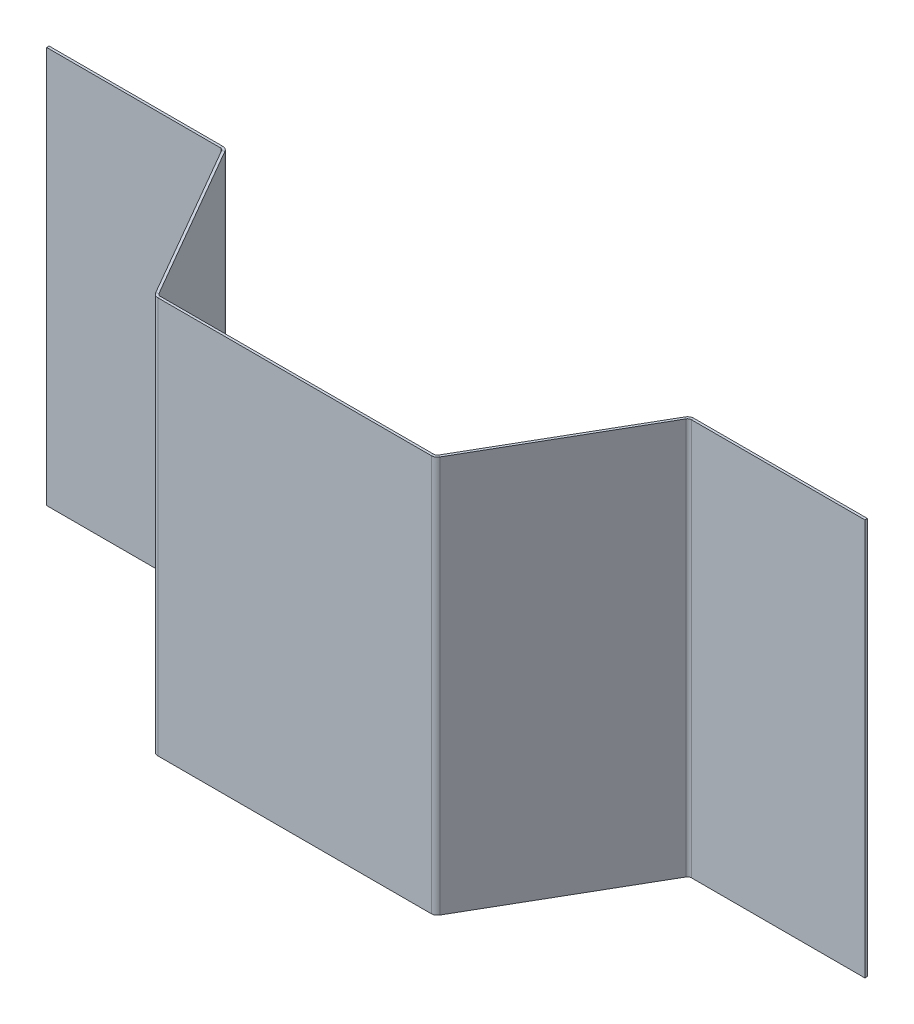
ISO-10303-21;
HEADER;
FILE_DESCRIPTION(('STEP AP214'),'2;1');
FILE_NAME('part.step','',(''),(''),'','','');
FILE_SCHEMA(('AUTOMOTIVE_DESIGN { 1 0 10303 214 1 1 1 1 }'));
ENDSEC;
DATA;
#1=APPLICATION_CONTEXT('core data for automotive mechanical design processes');
#2=APPLICATION_PROTOCOL_DEFINITION('international standard','automotive_design',2000,#1);
#3=PRODUCT_CONTEXT('',#1,'mechanical');
#4=PRODUCT('Part','Part','',(#3));
#5=PRODUCT_RELATED_PRODUCT_CATEGORY('part','',(#4));
#6=PRODUCT_DEFINITION_FORMATION('','',#4);
#7=PRODUCT_DEFINITION_CONTEXT('part definition',#1,'design');
#8=PRODUCT_DEFINITION('design','',#6,#7);
#9=PRODUCT_DEFINITION_SHAPE('','',#8);
#10=(LENGTH_UNIT() NAMED_UNIT(*) SI_UNIT(.MILLI.,.METRE.));
#11=(NAMED_UNIT(*) PLANE_ANGLE_UNIT() SI_UNIT($,.RADIAN.));
#12=(NAMED_UNIT(*) SI_UNIT($,.STERADIAN.) SOLID_ANGLE_UNIT());
#13=UNCERTAINTY_MEASURE_WITH_UNIT(LENGTH_MEASURE(1.E-05),#10,'distance_accuracy_value','');
#14=(GEOMETRIC_REPRESENTATION_CONTEXT(3) GLOBAL_UNCERTAINTY_ASSIGNED_CONTEXT((#13)) GLOBAL_UNIT_ASSIGNED_CONTEXT((#10,
#11,#12)) REPRESENTATION_CONTEXT('',''));
#15=CARTESIAN_POINT('',(0.,0.,0.));
#16=DIRECTION('',(0.,0.,1.));
#17=DIRECTION('',(1.,0.,0.));
#18=AXIS2_PLACEMENT_3D('',#15,#16,#17);
#19=CARTESIAN_POINT('',(92.8060796608384,-160.,-63.75));
#20=DIRECTION('',(0.,-1.,0.));
#21=DIRECTION('',(0.,0.,-1.));
#22=AXIS2_PLACEMENT_3D('',#19,#20,#21);
#23=PLANE('',#22);
#24=DIRECTION('',(0.866025403784445,0.,0.499999999999988));
#25=VECTOR('',#24,1.);
#26=CARTESIAN_POINT('',(92.8060796608384,-160.,-63.75));
#27=LINE('',#26,#25);
#28=CARTESIAN_POINT('',(92.8060796608384,-160.,-63.75));
#29=VERTEX_POINT('',#28);
#30=CARTESIAN_POINT('',(93.6721050646228,-160.,-63.25));
#31=VERTEX_POINT('',#30);
#32=EDGE_CURVE('E11',#29,#31,#27,.T.);
#33=ORIENTED_EDGE('',*,*,#32,.F.);
#34=CARTESIAN_POINT('',(94.9711431702995,-160.,-62.5));
#35=DIRECTION('',(0.,-1.,0.));
#36=DIRECTION('',(0.,0.,-1.));
#37=AXIS2_PLACEMENT_3D('',#34,#35,#36);
#38=CIRCLE('',#37,2.5);
#39=CARTESIAN_POINT('',(94.9711431702995,-160.,-65.));
#40=VERTEX_POINT('',#39);
#41=EDGE_CURVE('E367',#40,#29,#38,.F.);
#42=ORIENTED_EDGE('',*,*,#41,.F.);
#43=DIRECTION('',(0.,0.,-1.));
#44=VECTOR('',#43,1.);
#45=CARTESIAN_POINT('',(94.9711431702995,-160.,-64.));
#46=LINE('',#45,#44);
#47=CARTESIAN_POINT('',(94.9711431702995,-160.,-64.));
#48=VERTEX_POINT('',#47);
#49=EDGE_CURVE('E46',#48,#40,#46,.T.);
#50=ORIENTED_EDGE('',*,*,#49,.F.);
#51=CARTESIAN_POINT('',(94.9711431702995,-160.,-62.5));
#52=DIRECTION('',(0.,-1.,0.));
#53=DIRECTION('',(1.,0.,0.));
#54=AXIS2_PLACEMENT_3D('',#51,#52,#53);
#55=CIRCLE('',#54,1.5);
#56=EDGE_CURVE('E380',#48,#31,#55,.F.);
#57=ORIENTED_EDGE('',*,*,#56,.T.);
#58=EDGE_LOOP('',(#33,#42,#50,#57));
#59=FACE_BOUND('',#58,.T.);
#60=ADVANCED_FACE('F38',(#59),#23,.T.);
#61=CARTESIAN_POINT('',(94.9711431702995,-160.,-64.));
#62=DIRECTION('',(0.,-1.,0.));
#63=DIRECTION('',(0.,0.,-1.));
#64=AXIS2_PLACEMENT_3D('',#61,#62,#63);
#65=PLANE('',#64);
#66=DIRECTION('',(-0.499999999999998,0.,0.86602540378444));
#67=VECTOR('',#66,1.);
#68=CARTESIAN_POINT('',(56.,-160.,0.));
#69=LINE('',#68,#67);
#70=CARTESIAN_POINT('',(56.4330127018922,-160.,-0.75000000000002));
#71=VERTEX_POINT('',#70);
#72=EDGE_CURVE('E371',#29,#71,#69,.T.);
#73=ORIENTED_EDGE('',*,*,#72,.F.);
#74=ORIENTED_EDGE('',*,*,#32,.T.);
#75=DIRECTION('',(-0.499999999999998,0.,0.86602540378444));
#76=VECTOR('',#75,1.);
#77=CARTESIAN_POINT('',(56.8660254037844,-160.,0.499999999999985));
#78=LINE('',#77,#76);
#79=CARTESIAN_POINT('',(57.2990381056767,-160.,-0.250000000000021));
#80=VERTEX_POINT('',#79);
#81=EDGE_CURVE('E382',#31,#80,#78,.T.);
#82=ORIENTED_EDGE('',*,*,#81,.T.);
#83=DIRECTION('',(-0.86602540378444,0.,-0.499999999999997));
#84=VECTOR('',#83,1.);
#85=CARTESIAN_POINT('',(57.2990381056767,-160.,-0.250000000000021));
#86=LINE('',#85,#84);
#87=EDGE_CURVE('E341',#80,#71,#86,.T.);
#88=ORIENTED_EDGE('',*,*,#87,.T.);
#89=EDGE_LOOP('',(#73,#74,#82,#88));
#90=FACE_BOUND('',#89,.T.);
#91=ADVANCED_FACE('F451',(#90),#65,.T.);
#92=CARTESIAN_POINT('',(94.9711431702995,0.,-65.));
#93=DIRECTION('',(0.,1.,0.));
#94=DIRECTION('',(0.,0.,1.));
#95=AXIS2_PLACEMENT_3D('',#92,#93,#94);
#96=PLANE('',#95);
#97=DIRECTION('',(0.,0.,1.));
#98=VECTOR('',#97,1.);
#99=CARTESIAN_POINT('',(94.9711431702995,0.,-65.));
#100=LINE('',#99,#98);
#101=CARTESIAN_POINT('',(94.9711431702995,0.,-65.));
#102=VERTEX_POINT('',#101);
#103=CARTESIAN_POINT('',(94.9711431702995,0.,-64.));
#104=VERTEX_POINT('',#103);
#105=EDGE_CURVE('E347',#102,#104,#100,.T.);
#106=ORIENTED_EDGE('',*,*,#105,.F.);
#107=CARTESIAN_POINT('',(94.9711431702995,0.,-62.5));
#108=DIRECTION('',(0.,-1.,0.));
#109=DIRECTION('',(0.,0.,-1.));
#110=AXIS2_PLACEMENT_3D('',#107,#108,#109);
#111=CIRCLE('',#110,2.5);
#112=CARTESIAN_POINT('',(92.8060796608384,0.,-63.75));
#113=VERTEX_POINT('',#112);
#114=EDGE_CURVE('E251',#102,#113,#111,.F.);
#115=ORIENTED_EDGE('',*,*,#114,.T.);
#116=DIRECTION('',(-0.866025403784445,0.,-0.499999999999988));
#117=VECTOR('',#116,1.);
#118=CARTESIAN_POINT('',(93.6721050646228,0.,-63.25));
#119=LINE('',#118,#117);
#120=CARTESIAN_POINT('',(93.6721050646228,0.,-63.25));
#121=VERTEX_POINT('',#120);
#122=EDGE_CURVE('E345',#121,#113,#119,.T.);
#123=ORIENTED_EDGE('',*,*,#122,.F.);
#124=CARTESIAN_POINT('',(94.9711431702995,0.,-62.5));
#125=DIRECTION('',(0.,-1.,0.));
#126=DIRECTION('',(1.,0.,0.));
#127=AXIS2_PLACEMENT_3D('',#124,#125,#126);
#128=CIRCLE('',#127,1.5);
#129=EDGE_CURVE('E263',#104,#121,#128,.F.);
#130=ORIENTED_EDGE('',*,*,#129,.F.);
#131=EDGE_LOOP('',(#106,#115,#123,#130));
#132=FACE_BOUND('',#131,.T.);
#133=ADVANCED_FACE('F493',(#132),#96,.T.);
#134=CARTESIAN_POINT('',(93.6721050646228,0.,-63.25));
#135=DIRECTION('',(0.,1.,0.));
#136=DIRECTION('',(0.,0.,1.));
#137=AXIS2_PLACEMENT_3D('',#134,#135,#136);
#138=PLANE('',#137);
#139=DIRECTION('',(-1.,0.,0.));
#140=VECTOR('',#139,1.);
#141=CARTESIAN_POINT('',(93.5277674973254,0.,-65.));
#142=LINE('',#141,#140);
#143=CARTESIAN_POINT('',(165.,0.,-65.));
#144=VERTEX_POINT('',#143);
#145=EDGE_CURVE('E254',#144,#102,#142,.T.);
#146=ORIENTED_EDGE('',*,*,#145,.T.);
#147=ORIENTED_EDGE('',*,*,#105,.T.);
#148=DIRECTION('',(1.,0.,0.));
#149=VECTOR('',#148,1.);
#150=CARTESIAN_POINT('',(93.5277674973254,0.,-64.));
#151=LINE('',#150,#149);
#152=CARTESIAN_POINT('',(165.,0.,-64.));
#153=VERTEX_POINT('',#152);
#154=EDGE_CURVE('E260',#153,#104,#151,.F.);
#155=ORIENTED_EDGE('',*,*,#154,.F.);
#156=DIRECTION('',(0.,0.,-1.));
#157=VECTOR('',#156,1.);
#158=CARTESIAN_POINT('',(165.,0.,-64.));
#159=LINE('',#158,#157);
#160=EDGE_CURVE('E257',#153,#144,#159,.T.);
#161=ORIENTED_EDGE('',*,*,#160,.T.);
#162=EDGE_LOOP('',(#146,#147,#155,#161));
#163=FACE_BOUND('',#162,.T.);
#164=ADVANCED_FACE('F497',(#163),#138,.T.);
#165=CARTESIAN_POINT('',(55.1339745962156,-160.,0.));
#166=DIRECTION('',(0.,-1.,0.));
#167=DIRECTION('',(0.,0.,-1.));
#168=AXIS2_PLACEMENT_3D('',#165,#166,#167);
#169=PLANE('',#168);
#170=DIRECTION('',(0.,0.,1.));
#171=VECTOR('',#170,1.);
#172=CARTESIAN_POINT('',(55.1339745962156,-160.,0.));
#173=LINE('',#172,#171);
#174=CARTESIAN_POINT('',(55.1339745962156,-160.,0.));
#175=VERTEX_POINT('',#174);
#176=CARTESIAN_POINT('',(55.1339745962156,-160.,0.999999999999987));
#177=VERTEX_POINT('',#176);
#178=EDGE_CURVE('E343',#175,#177,#173,.T.);
#179=ORIENTED_EDGE('',*,*,#178,.F.);
#180=CARTESIAN_POINT('',(55.1339745962156,-160.,-1.50000000000001));
#181=DIRECTION('',(0.,1.,0.));
#182=DIRECTION('',(0.,0.,1.));
#183=AXIS2_PLACEMENT_3D('',#180,#181,#182);
#184=CIRCLE('',#183,1.5);
#185=EDGE_CURVE('E441',#71,#175,#184,.F.);
#186=ORIENTED_EDGE('',*,*,#185,.F.);
#187=ORIENTED_EDGE('',*,*,#87,.F.);
#188=CARTESIAN_POINT('',(55.1339745962156,-160.,-1.50000000000001));
#189=DIRECTION('',(0.,-1.,0.));
#190=DIRECTION('',(1.,0.,0.));
#191=AXIS2_PLACEMENT_3D('',#188,#189,#190);
#192=CIRCLE('',#191,2.5);
#193=EDGE_CURVE('E385',#80,#177,#192,.T.);
#194=ORIENTED_EDGE('',*,*,#193,.T.);
#195=EDGE_LOOP('',(#179,#186,#187,#194));
#196=FACE_BOUND('',#195,.T.);
#197=ADVANCED_FACE('F458',(#196),#169,.T.);
#198=CARTESIAN_POINT('',(57.2990381056767,-160.,-0.250000000000021));
#199=DIRECTION('',(0.,-1.,0.));
#200=DIRECTION('',(0.,0.,-1.));
#201=AXIS2_PLACEMENT_3D('',#198,#199,#200);
#202=PLANE('',#201);
#203=DIRECTION('',(-1.,0.,0.));
#204=VECTOR('',#203,1.);
#205=CARTESIAN_POINT('',(56.,-160.,0.));
#206=LINE('',#205,#204);
#207=CARTESIAN_POINT('',(-55.1339745962156,-160.,0.));
#208=VERTEX_POINT('',#207);
#209=EDGE_CURVE('E438',#175,#208,#206,.T.);
#210=ORIENTED_EDGE('',*,*,#209,.F.);
#211=ORIENTED_EDGE('',*,*,#178,.T.);
#212=DIRECTION('',(1.,0.,0.));
#213=VECTOR('',#212,1.);
#214=CARTESIAN_POINT('',(56.,-160.,0.999999999999987));
#215=LINE('',#214,#213);
#216=CARTESIAN_POINT('',(-55.1339745962156,-160.,0.999999999999988));
#217=VERTEX_POINT('',#216);
#218=EDGE_CURVE('E205',#177,#217,#215,.F.);
#219=ORIENTED_EDGE('',*,*,#218,.T.);
#220=DIRECTION('',(0.,0.,-1.));
#221=VECTOR('',#220,1.);
#222=CARTESIAN_POINT('',(-55.1339745962156,-160.,0.999999999999988));
#223=LINE('',#222,#221);
#224=EDGE_CURVE('E196',#217,#208,#223,.T.);
#225=ORIENTED_EDGE('',*,*,#224,.T.);
#226=EDGE_LOOP('',(#210,#211,#219,#225));
#227=FACE_BOUND('',#226,.T.);
#228=ADVANCED_FACE('F391',(#227),#202,.T.);
#229=CARTESIAN_POINT('',(56.4330127018922,0.,-0.75000000000002));
#230=DIRECTION('',(0.,1.,0.));
#231=DIRECTION('',(0.,0.,1.));
#232=AXIS2_PLACEMENT_3D('',#229,#230,#231);
#233=PLANE('',#232);
#234=DIRECTION('',(0.86602540378444,0.,0.499999999999997));
#235=VECTOR('',#234,1.);
#236=CARTESIAN_POINT('',(56.4330127018922,0.,-0.75000000000002));
#237=LINE('',#236,#235);
#238=CARTESIAN_POINT('',(56.4330127018922,0.,-0.75000000000002));
#239=VERTEX_POINT('',#238);
#240=CARTESIAN_POINT('',(57.2990381056767,0.,-0.250000000000021));
#241=VERTEX_POINT('',#240);
#242=EDGE_CURVE('E339',#239,#241,#237,.T.);
#243=ORIENTED_EDGE('',*,*,#242,.F.);
#244=CARTESIAN_POINT('',(55.1339745962156,0.,-1.50000000000001));
#245=DIRECTION('',(0.,1.,0.));
#246=DIRECTION('',(0.,0.,1.));
#247=AXIS2_PLACEMENT_3D('',#244,#245,#246);
#248=CIRCLE('',#247,1.5);
#249=CARTESIAN_POINT('',(55.1339745962156,0.,0.));
#250=VERTEX_POINT('',#249);
#251=EDGE_CURVE('E245',#239,#250,#248,.F.);
#252=ORIENTED_EDGE('',*,*,#251,.T.);
#253=DIRECTION('',(0.,0.,-1.));
#254=VECTOR('',#253,1.);
#255=CARTESIAN_POINT('',(55.1339745962156,0.,0.999999999999987));
#256=LINE('',#255,#254);
#257=CARTESIAN_POINT('',(55.1339745962156,0.,0.999999999999987));
#258=VERTEX_POINT('',#257);
#259=EDGE_CURVE('E195',#258,#250,#256,.T.);
#260=ORIENTED_EDGE('',*,*,#259,.F.);
#261=CARTESIAN_POINT('',(55.1339745962156,0.,-1.50000000000001));
#262=DIRECTION('',(0.,-1.,0.));
#263=DIRECTION('',(1.,0.,0.));
#264=AXIS2_PLACEMENT_3D('',#261,#262,#263);
#265=CIRCLE('',#264,2.5);
#266=EDGE_CURVE('E269',#241,#258,#265,.T.);
#267=ORIENTED_EDGE('',*,*,#266,.F.);
#268=EDGE_LOOP('',(#243,#252,#260,#267));
#269=FACE_BOUND('',#268,.T.);
#270=ADVANCED_FACE('F467',(#269),#233,.T.);
#271=CARTESIAN_POINT('',(55.1339745962156,0.,0.999999999999987));
#272=DIRECTION('',(0.,1.,0.));
#273=DIRECTION('',(0.,0.,1.));
#274=AXIS2_PLACEMENT_3D('',#271,#272,#273);
#275=PLANE('',#274);
#276=DIRECTION('',(-0.499999999999998,0.,0.86602540378444));
#277=VECTOR('',#276,1.);
#278=CARTESIAN_POINT('',(56.,0.,0.));
#279=LINE('',#278,#277);
#280=EDGE_CURVE('E248',#113,#239,#279,.T.);
#281=ORIENTED_EDGE('',*,*,#280,.T.);
#282=ORIENTED_EDGE('',*,*,#242,.T.);
#283=DIRECTION('',(-0.499999999999998,0.,0.86602540378444));
#284=VECTOR('',#283,1.);
#285=CARTESIAN_POINT('',(56.8660254037844,0.,0.499999999999985));
#286=LINE('',#285,#284);
#287=EDGE_CURVE('E266',#121,#241,#286,.T.);
#288=ORIENTED_EDGE('',*,*,#287,.F.);
#289=ORIENTED_EDGE('',*,*,#122,.T.);
#290=EDGE_LOOP('',(#281,#282,#288,#289));
#291=FACE_BOUND('',#290,.T.);
#292=ADVANCED_FACE('F471',(#291),#275,.T.);
#293=CARTESIAN_POINT('',(-56.4330127018922,-160.,-0.750000000000017));
#294=DIRECTION('',(0.,-1.,0.));
#295=DIRECTION('',(0.,0.,-1.));
#296=AXIS2_PLACEMENT_3D('',#293,#294,#295);
#297=PLANE('',#296);
#298=DIRECTION('',(-0.866025403784441,0.,0.499999999999995));
#299=VECTOR('',#298,1.);
#300=CARTESIAN_POINT('',(-56.4330127018922,-160.,-0.750000000000017));
#301=LINE('',#300,#299);
#302=CARTESIAN_POINT('',(-56.4330127018922,-160.,-0.750000000000017));
#303=VERTEX_POINT('',#302);
#304=CARTESIAN_POINT('',(-57.2990381056767,-160.,-0.250000000000021));
#305=VERTEX_POINT('',#304);
#306=EDGE_CURVE('E183',#303,#305,#301,.T.);
#307=ORIENTED_EDGE('',*,*,#306,.F.);
#308=CARTESIAN_POINT('',(-55.1339745962156,-160.,-1.50000000000001));
#309=DIRECTION('',(0.,1.,0.));
#310=DIRECTION('',(0.,0.,1.));
#311=AXIS2_PLACEMENT_3D('',#308,#309,#310);
#312=CIRCLE('',#311,1.5);
#313=EDGE_CURVE('E403',#208,#303,#312,.F.);
#314=ORIENTED_EDGE('',*,*,#313,.F.);
#315=ORIENTED_EDGE('',*,*,#224,.F.);
#316=CARTESIAN_POINT('',(-55.1339745962156,-160.,-1.50000000000001));
#317=DIRECTION('',(0.,-1.,0.));
#318=DIRECTION('',(1.,0.,0.));
#319=AXIS2_PLACEMENT_3D('',#316,#317,#318);
#320=CIRCLE('',#319,2.5);
#321=EDGE_CURVE('E199',#217,#305,#320,.T.);
#322=ORIENTED_EDGE('',*,*,#321,.T.);
#323=EDGE_LOOP('',(#307,#314,#315,#322));
#324=FACE_BOUND('',#323,.T.);
#325=ADVANCED_FACE('F201',(#324),#297,.T.);
#326=CARTESIAN_POINT('',(-55.1339745962156,-160.,0.999999999999988));
#327=DIRECTION('',(0.,-1.,0.));
#328=DIRECTION('',(0.,0.,-1.));
#329=AXIS2_PLACEMENT_3D('',#326,#327,#328);
#330=PLANE('',#329);
#331=DIRECTION('',(-0.499999999999998,0.,-0.86602540378444));
#332=VECTOR('',#331,1.);
#333=CARTESIAN_POINT('',(-56.,-160.,0.));
#334=LINE('',#333,#332);
#335=CARTESIAN_POINT('',(-92.8060796608384,-160.,-63.75));
#336=VERTEX_POINT('',#335);
#337=EDGE_CURVE('E190',#303,#336,#334,.T.);
#338=ORIENTED_EDGE('',*,*,#337,.F.);
#339=ORIENTED_EDGE('',*,*,#306,.T.);
#340=DIRECTION('',(-0.499999999999998,0.,-0.86602540378444));
#341=VECTOR('',#340,1.);
#342=CARTESIAN_POINT('',(-56.8660254037844,-160.,0.499999999999985));
#343=LINE('',#342,#341);
#344=CARTESIAN_POINT('',(-93.6721050646228,-160.,-63.25));
#345=VERTEX_POINT('',#344);
#346=EDGE_CURVE('E187',#305,#345,#343,.T.);
#347=ORIENTED_EDGE('',*,*,#346,.T.);
#348=DIRECTION('',(0.866025403784439,0.,-0.499999999999998));
#349=VECTOR('',#348,1.);
#350=CARTESIAN_POINT('',(-93.6721050646228,-160.,-63.25));
#351=LINE('',#350,#349);
#352=EDGE_CURVE('E330',#345,#336,#351,.T.);
#353=ORIENTED_EDGE('',*,*,#352,.T.);
#354=EDGE_LOOP('',(#338,#339,#347,#353));
#355=FACE_BOUND('',#354,.T.);
#356=ADVANCED_FACE('F185',(#355),#330,.T.);
#357=CARTESIAN_POINT('',(-55.1339745962156,0.,0.));
#358=DIRECTION('',(0.,1.,0.));
#359=DIRECTION('',(0.,0.,1.));
#360=AXIS2_PLACEMENT_3D('',#357,#358,#359);
#361=PLANE('',#360);
#362=DIRECTION('',(0.,0.,1.));
#363=VECTOR('',#362,1.);
#364=CARTESIAN_POINT('',(-55.1339745962156,0.,0.));
#365=LINE('',#364,#363);
#366=CARTESIAN_POINT('',(-55.1339745962156,0.,0.));
#367=VERTEX_POINT('',#366);
#368=CARTESIAN_POINT('',(-55.1339745962156,0.,0.999999999999988));
#369=VERTEX_POINT('',#368);
#370=EDGE_CURVE('E335',#367,#369,#365,.T.);
#371=ORIENTED_EDGE('',*,*,#370,.F.);
#372=CARTESIAN_POINT('',(-55.1339745962156,0.,-1.50000000000001));
#373=DIRECTION('',(0.,1.,0.));
#374=DIRECTION('',(0.,0.,1.));
#375=AXIS2_PLACEMENT_3D('',#372,#373,#374);
#376=CIRCLE('',#375,1.5);
#377=CARTESIAN_POINT('',(-56.4330127018922,0.,-0.750000000000017));
#378=VERTEX_POINT('',#377);
#379=EDGE_CURVE('E239',#367,#378,#376,.F.);
#380=ORIENTED_EDGE('',*,*,#379,.T.);
#381=DIRECTION('',(0.866025403784441,0.,-0.499999999999995));
#382=VECTOR('',#381,1.);
#383=CARTESIAN_POINT('',(-57.2990381056767,0.,-0.250000000000021));
#384=LINE('',#383,#382);
#385=CARTESIAN_POINT('',(-57.2990381056767,0.,-0.250000000000021));
#386=VERTEX_POINT('',#385);
#387=EDGE_CURVE('E333',#386,#378,#384,.T.);
#388=ORIENTED_EDGE('',*,*,#387,.F.);
#389=CARTESIAN_POINT('',(-55.1339745962156,0.,-1.50000000000001));
#390=DIRECTION('',(0.,-1.,0.));
#391=DIRECTION('',(1.,0.,0.));
#392=AXIS2_PLACEMENT_3D('',#389,#390,#391);
#393=CIRCLE('',#392,2.5);
#394=EDGE_CURVE('E212',#369,#386,#393,.T.);
#395=ORIENTED_EDGE('',*,*,#394,.F.);
#396=EDGE_LOOP('',(#371,#380,#388,#395));
#397=FACE_BOUND('',#396,.T.);
#398=ADVANCED_FACE('F397',(#397),#361,.T.);
#399=CARTESIAN_POINT('',(-57.2990381056767,0.,-0.250000000000021));
#400=DIRECTION('',(0.,1.,0.));
#401=DIRECTION('',(0.,0.,1.));
#402=AXIS2_PLACEMENT_3D('',#399,#400,#401);
#403=PLANE('',#402);
#404=DIRECTION('',(-1.,0.,0.));
#405=VECTOR('',#404,1.);
#406=CARTESIAN_POINT('',(56.,0.,0.));
#407=LINE('',#406,#405);
#408=EDGE_CURVE('E242',#250,#367,#407,.T.);
#409=ORIENTED_EDGE('',*,*,#408,.T.);
#410=ORIENTED_EDGE('',*,*,#370,.T.);
#411=DIRECTION('',(1.,0.,0.));
#412=VECTOR('',#411,1.);
#413=CARTESIAN_POINT('',(56.,0.,0.999999999999987));
#414=LINE('',#413,#412);
#415=EDGE_CURVE('E272',#258,#369,#414,.F.);
#416=ORIENTED_EDGE('',*,*,#415,.F.);
#417=ORIENTED_EDGE('',*,*,#259,.T.);
#418=EDGE_LOOP('',(#409,#410,#416,#417));
#419=FACE_BOUND('',#418,.T.);
#420=ADVANCED_FACE('F477',(#419),#403,.T.);
#421=CARTESIAN_POINT('',(-94.9711431702995,-160.,-65.));
#422=DIRECTION('',(0.,-1.,0.));
#423=DIRECTION('',(0.,0.,-1.));
#424=AXIS2_PLACEMENT_3D('',#421,#422,#423);
#425=PLANE('',#424);
#426=DIRECTION('',(0.,0.,1.));
#427=VECTOR('',#426,1.);
#428=CARTESIAN_POINT('',(-94.9711431702995,-160.,-65.));
#429=LINE('',#428,#427);
#430=CARTESIAN_POINT('',(-94.9711431702995,-160.,-65.));
#431=VERTEX_POINT('',#430);
#432=CARTESIAN_POINT('',(-94.9711431702995,-160.,-64.));
#433=VERTEX_POINT('',#432);
#434=EDGE_CURVE('E54',#431,#433,#429,.T.);
#435=ORIENTED_EDGE('',*,*,#434,.F.);
#436=CARTESIAN_POINT('',(-94.9711431702995,-160.,-62.5));
#437=DIRECTION('',(0.,-1.,0.));
#438=DIRECTION('',(0.,0.,-1.));
#439=AXIS2_PLACEMENT_3D('',#436,#437,#438);
#440=CIRCLE('',#439,2.5);
#441=EDGE_CURVE('E431',#336,#431,#440,.F.);
#442=ORIENTED_EDGE('',*,*,#441,.F.);
#443=ORIENTED_EDGE('',*,*,#352,.F.);
#444=CARTESIAN_POINT('',(-94.9711431702995,-160.,-62.5));
#445=DIRECTION('',(0.,-1.,0.));
#446=DIRECTION('',(1.,0.,0.));
#447=AXIS2_PLACEMENT_3D('',#444,#445,#446);
#448=CIRCLE('',#447,1.5);
#449=EDGE_CURVE('E220',#345,#433,#448,.F.);
#450=ORIENTED_EDGE('',*,*,#449,.T.);
#451=EDGE_LOOP('',(#435,#442,#443,#450));
#452=FACE_BOUND('',#451,.T.);
#453=ADVANCED_FACE('F479',(#452),#425,.T.);
#454=CARTESIAN_POINT('',(-93.6721050646228,-160.,-63.25));
#455=DIRECTION('',(0.,-1.,0.));
#456=DIRECTION('',(0.,0.,-1.));
#457=AXIS2_PLACEMENT_3D('',#454,#455,#456);
#458=PLANE('',#457);
#459=DIRECTION('',(-1.,0.,0.));
#460=VECTOR('',#459,1.);
#461=CARTESIAN_POINT('',(-93.5277674973254,-160.,-65.));
#462=LINE('',#461,#460);
#463=CARTESIAN_POINT('',(-165.,-160.,-65.));
#464=VERTEX_POINT('',#463);
#465=EDGE_CURVE('E429',#431,#464,#462,.T.);
#466=ORIENTED_EDGE('',*,*,#465,.F.);
#467=ORIENTED_EDGE('',*,*,#434,.T.);
#468=DIRECTION('',(1.,0.,0.));
#469=VECTOR('',#468,1.);
#470=CARTESIAN_POINT('',(-93.5277674973254,-160.,-64.));
#471=LINE('',#470,#469);
#472=CARTESIAN_POINT('',(-165.,-160.,-64.));
#473=VERTEX_POINT('',#472);
#474=EDGE_CURVE('E132',#433,#473,#471,.F.);
#475=ORIENTED_EDGE('',*,*,#474,.T.);
#476=DIRECTION('',(0.,0.,1.));
#477=VECTOR('',#476,1.);
#478=CARTESIAN_POINT('',(-165.,-160.,-65.));
#479=LINE('',#478,#477);
#480=EDGE_CURVE('E427',#464,#473,#479,.T.);
#481=ORIENTED_EDGE('',*,*,#480,.F.);
#482=EDGE_LOOP('',(#466,#467,#475,#481));
#483=FACE_BOUND('',#482,.T.);
#484=ADVANCED_FACE('F485',(#483),#458,.T.);
#485=CARTESIAN_POINT('',(-92.8060796608384,0.,-63.75));
#486=DIRECTION('',(0.,1.,0.));
#487=DIRECTION('',(0.,0.,1.));
#488=AXIS2_PLACEMENT_3D('',#485,#486,#487);
#489=PLANE('',#488);
#490=DIRECTION('',(-0.866025403784439,0.,0.499999999999998));
#491=VECTOR('',#490,1.);
#492=CARTESIAN_POINT('',(-92.8060796608384,0.,-63.75));
#493=LINE('',#492,#491);
#494=CARTESIAN_POINT('',(-92.8060796608384,0.,-63.75));
#495=VERTEX_POINT('',#494);
#496=CARTESIAN_POINT('',(-93.6721050646228,0.,-63.25));
#497=VERTEX_POINT('',#496);
#498=EDGE_CURVE('E119',#495,#497,#493,.T.);
#499=ORIENTED_EDGE('',*,*,#498,.F.);
#500=CARTESIAN_POINT('',(-94.9711431702995,0.,-62.5));
#501=DIRECTION('',(0.,-1.,0.));
#502=DIRECTION('',(0.,0.,-1.));
#503=AXIS2_PLACEMENT_3D('',#500,#501,#502);
#504=CIRCLE('',#503,2.5);
#505=CARTESIAN_POINT('',(-94.9711431702995,0.,-65.));
#506=VERTEX_POINT('',#505);
#507=EDGE_CURVE('E235',#495,#506,#504,.F.);
#508=ORIENTED_EDGE('',*,*,#507,.T.);
#509=DIRECTION('',(0.,0.,-1.));
#510=VECTOR('',#509,1.);
#511=CARTESIAN_POINT('',(-94.9711431702995,0.,-64.));
#512=LINE('',#511,#510);
#513=CARTESIAN_POINT('',(-94.9711431702995,0.,-64.));
#514=VERTEX_POINT('',#513);
#515=EDGE_CURVE('E126',#514,#506,#512,.T.);
#516=ORIENTED_EDGE('',*,*,#515,.F.);
#517=CARTESIAN_POINT('',(-94.9711431702995,0.,-62.5));
#518=DIRECTION('',(0.,-1.,0.));
#519=DIRECTION('',(1.,0.,0.));
#520=AXIS2_PLACEMENT_3D('',#517,#518,#519);
#521=CIRCLE('',#520,1.5);
#522=EDGE_CURVE('E278',#497,#514,#521,.F.);
#523=ORIENTED_EDGE('',*,*,#522,.F.);
#524=EDGE_LOOP('',(#499,#508,#516,#523));
#525=FACE_BOUND('',#524,.T.);
#526=ADVANCED_FACE('F414',(#525),#489,.T.);
#527=CARTESIAN_POINT('',(-94.9711431702995,0.,-64.));
#528=DIRECTION('',(0.,1.,0.));
#529=DIRECTION('',(0.,0.,1.));
#530=AXIS2_PLACEMENT_3D('',#527,#528,#529);
#531=PLANE('',#530);
#532=DIRECTION('',(-0.499999999999998,0.,-0.86602540378444));
#533=VECTOR('',#532,1.);
#534=CARTESIAN_POINT('',(-56.,0.,0.));
#535=LINE('',#534,#533);
#536=EDGE_CURVE('E237',#378,#495,#535,.T.);
#537=ORIENTED_EDGE('',*,*,#536,.T.);
#538=ORIENTED_EDGE('',*,*,#498,.T.);
#539=DIRECTION('',(-0.499999999999998,0.,-0.86602540378444));
#540=VECTOR('',#539,1.);
#541=CARTESIAN_POINT('',(-56.8660254037844,0.,0.499999999999985));
#542=LINE('',#541,#540);
#543=EDGE_CURVE('E276',#386,#497,#542,.T.);
#544=ORIENTED_EDGE('',*,*,#543,.F.);
#545=ORIENTED_EDGE('',*,*,#387,.T.);
#546=EDGE_LOOP('',(#537,#538,#544,#545));
#547=FACE_BOUND('',#546,.T.);
#548=ADVANCED_FACE('F399',(#547),#531,.T.);
#549=CARTESIAN_POINT('',(-93.5277674973254,-160.,-64.));
#550=DIRECTION('',(0.,0.,-1.));
#551=DIRECTION('',(-1.,0.,0.));
#552=AXIS2_PLACEMENT_3D('',#549,#550,#551);
#553=PLANE('',#552);
#554=DIRECTION('',(1.,0.,0.));
#555=VECTOR('',#554,1.);
#556=CARTESIAN_POINT('',(-93.5277674973254,0.,-64.));
#557=LINE('',#556,#555);
#558=CARTESIAN_POINT('',(-165.,0.,-64.));
#559=VERTEX_POINT('',#558);
#560=EDGE_CURVE('E226',#514,#559,#557,.F.);
#561=ORIENTED_EDGE('',*,*,#560,.T.);
#562=DIRECTION('',(0.,1.,0.));
#563=VECTOR('',#562,1.);
#564=CARTESIAN_POINT('',(-165.,-160.,-64.));
#565=LINE('',#564,#563);
#566=EDGE_CURVE('E326',#473,#559,#565,.T.);
#567=ORIENTED_EDGE('',*,*,#566,.F.);
#568=ORIENTED_EDGE('',*,*,#474,.F.);
#569=DIRECTION('',(0.,1.,0.));
#570=VECTOR('',#569,1.);
#571=CARTESIAN_POINT('',(-94.9711431702995,-160.,-64.));
#572=LINE('',#571,#570);
#573=EDGE_CURVE('E222',#433,#514,#572,.T.);
#574=ORIENTED_EDGE('',*,*,#573,.T.);
#575=EDGE_LOOP('',(#561,#567,#568,#574));
#576=FACE_BOUND('',#575,.T.);
#577=ADVANCED_FACE('F420',(#576),#553,.F.);
#578=CARTESIAN_POINT('',(-165.,-160.,-65.));
#579=DIRECTION('',(-1.,0.,0.));
#580=DIRECTION('',(0.,0.,1.));
#581=AXIS2_PLACEMENT_3D('',#578,#579,#580);
#582=PLANE('',#581);
#583=DIRECTION('',(0.,0.,1.));
#584=VECTOR('',#583,1.);
#585=CARTESIAN_POINT('',(-165.,0.,-65.));
#586=LINE('',#585,#584);
#587=CARTESIAN_POINT('',(-165.,0.,-65.));
#588=VERTEX_POINT('',#587);
#589=EDGE_CURVE('E229',#588,#559,#586,.T.);
#590=ORIENTED_EDGE('',*,*,#589,.F.);
#591=DIRECTION('',(0.,1.,0.));
#592=VECTOR('',#591,1.);
#593=CARTESIAN_POINT('',(-165.,-160.,-65.));
#594=LINE('',#593,#592);
#595=EDGE_CURVE('E324',#464,#588,#594,.T.);
#596=ORIENTED_EDGE('',*,*,#595,.F.);
#597=ORIENTED_EDGE('',*,*,#480,.T.);
#598=ORIENTED_EDGE('',*,*,#566,.T.);
#599=EDGE_LOOP('',(#590,#596,#597,#598));
#600=FACE_BOUND('',#599,.T.);
#601=ADVANCED_FACE('F425',(#600),#582,.T.);
#602=CARTESIAN_POINT('',(-93.5277674973254,-160.,-65.));
#603=DIRECTION('',(0.,0.,-1.));
#604=DIRECTION('',(-1.,0.,0.));
#605=AXIS2_PLACEMENT_3D('',#602,#603,#604);
#606=PLANE('',#605);
#607=DIRECTION('',(-1.,0.,0.));
#608=VECTOR('',#607,1.);
#609=CARTESIAN_POINT('',(-93.5277674973254,0.,-65.));
#610=LINE('',#609,#608);
#611=EDGE_CURVE('E232',#506,#588,#610,.T.);
#612=ORIENTED_EDGE('',*,*,#611,.F.);
#613=DIRECTION('',(0.,1.,0.));
#614=VECTOR('',#613,1.);
#615=CARTESIAN_POINT('',(-94.9711431702995,-160.,-65.));
#616=LINE('',#615,#614);
#617=EDGE_CURVE('E321',#431,#506,#616,.T.);
#618=ORIENTED_EDGE('',*,*,#617,.F.);
#619=ORIENTED_EDGE('',*,*,#465,.T.);
#620=ORIENTED_EDGE('',*,*,#595,.T.);
#621=EDGE_LOOP('',(#612,#618,#619,#620));
#622=FACE_BOUND('',#621,.T.);
#623=ADVANCED_FACE('F581',(#622),#606,.T.);
#624=CARTESIAN_POINT('',(-94.9711431702995,-160.,-62.5));
#625=DIRECTION('',(0.,1.,0.));
#626=DIRECTION('',(0.,0.,1.));
#627=AXIS2_PLACEMENT_3D('',#624,#625,#626);
#628=CYLINDRICAL_SURFACE('',#627,2.5);
#629=ORIENTED_EDGE('',*,*,#507,.F.);
#630=DIRECTION('',(0.,1.,0.));
#631=VECTOR('',#630,1.);
#632=CARTESIAN_POINT('',(-92.8060796608384,-160.,-63.75));
#633=LINE('',#632,#631);
#634=EDGE_CURVE('E318',#336,#495,#633,.T.);
#635=ORIENTED_EDGE('',*,*,#634,.F.);
#636=ORIENTED_EDGE('',*,*,#441,.T.);
#637=ORIENTED_EDGE('',*,*,#617,.T.);
#638=EDGE_LOOP('',(#629,#635,#636,#637));
#639=FACE_BOUND('',#638,.T.);
#640=ADVANCED_FACE('F411',(#639),#628,.T.);
#641=CARTESIAN_POINT('',(-56.,-160.,0.));
#642=DIRECTION('',(0.86602540378444,0.,-0.499999999999998));
#643=DIRECTION('',(-0.499999999999998,0.,-0.86602540378444));
#644=AXIS2_PLACEMENT_3D('',#641,#642,#643);
#645=PLANE('',#644);
#646=ORIENTED_EDGE('',*,*,#536,.F.);
#647=DIRECTION('',(0.,1.,0.));
#648=VECTOR('',#647,1.);
#649=CARTESIAN_POINT('',(-56.4330127018922,-160.,-0.750000000000017));
#650=LINE('',#649,#648);
#651=EDGE_CURVE('E315',#303,#378,#650,.T.);
#652=ORIENTED_EDGE('',*,*,#651,.F.);
#653=ORIENTED_EDGE('',*,*,#337,.T.);
#654=ORIENTED_EDGE('',*,*,#634,.T.);
#655=EDGE_LOOP('',(#646,#652,#653,#654));
#656=FACE_BOUND('',#655,.T.);
#657=ADVANCED_FACE('F405',(#656),#645,.T.);
#658=CARTESIAN_POINT('',(-55.1339745962156,-160.,-1.50000000000001));
#659=DIRECTION('',(0.,1.,0.));
#660=DIRECTION('',(0.,0.,1.));
#661=AXIS2_PLACEMENT_3D('',#658,#659,#660);
#662=CYLINDRICAL_SURFACE('',#661,1.5);
#663=ORIENTED_EDGE('',*,*,#379,.F.);
#664=DIRECTION('',(0.,1.,0.));
#665=VECTOR('',#664,1.);
#666=CARTESIAN_POINT('',(-55.1339745962156,-160.,0.));
#667=LINE('',#666,#665);
#668=EDGE_CURVE('E312',#208,#367,#667,.T.);
#669=ORIENTED_EDGE('',*,*,#668,.F.);
#670=ORIENTED_EDGE('',*,*,#313,.T.);
#671=ORIENTED_EDGE('',*,*,#651,.T.);
#672=EDGE_LOOP('',(#663,#669,#670,#671));
#673=FACE_BOUND('',#672,.T.);
#674=ADVANCED_FACE('F402',(#673),#662,.F.);
#675=CARTESIAN_POINT('',(56.,-160.,0.));
#676=DIRECTION('',(0.,0.,-1.));
#677=DIRECTION('',(-1.,0.,0.));
#678=AXIS2_PLACEMENT_3D('',#675,#676,#677);
#679=PLANE('',#678);
#680=ORIENTED_EDGE('',*,*,#408,.F.);
#681=DIRECTION('',(0.,1.,0.));
#682=VECTOR('',#681,1.);
#683=CARTESIAN_POINT('',(55.1339745962156,-160.,0.));
#684=LINE('',#683,#682);
#685=EDGE_CURVE('E309',#175,#250,#684,.T.);
#686=ORIENTED_EDGE('',*,*,#685,.F.);
#687=ORIENTED_EDGE('',*,*,#209,.T.);
#688=ORIENTED_EDGE('',*,*,#668,.T.);
#689=EDGE_LOOP('',(#680,#686,#687,#688));
#690=FACE_BOUND('',#689,.T.);
#691=ADVANCED_FACE('F464',(#690),#679,.T.);
#692=CARTESIAN_POINT('',(55.1339745962156,-160.,-1.50000000000001));
#693=DIRECTION('',(0.,1.,0.));
#694=DIRECTION('',(0.,0.,1.));
#695=AXIS2_PLACEMENT_3D('',#692,#693,#694);
#696=CYLINDRICAL_SURFACE('',#695,1.5);
#697=ORIENTED_EDGE('',*,*,#251,.F.);
#698=DIRECTION('',(0.,1.,0.));
#699=VECTOR('',#698,1.);
#700=CARTESIAN_POINT('',(56.4330127018922,-160.,-0.75000000000002));
#701=LINE('',#700,#699);
#702=EDGE_CURVE('E306',#71,#239,#701,.T.);
#703=ORIENTED_EDGE('',*,*,#702,.F.);
#704=ORIENTED_EDGE('',*,*,#185,.T.);
#705=ORIENTED_EDGE('',*,*,#685,.T.);
#706=EDGE_LOOP('',(#697,#703,#704,#705));
#707=FACE_BOUND('',#706,.T.);
#708=ADVANCED_FACE('F457',(#707),#696,.F.);
#709=CARTESIAN_POINT('',(56.,-160.,0.));
#710=DIRECTION('',(-0.86602540378444,0.,-0.499999999999998));
#711=DIRECTION('',(-0.499999999999998,0.,0.86602540378444));
#712=AXIS2_PLACEMENT_3D('',#709,#710,#711);
#713=PLANE('',#712);
#714=ORIENTED_EDGE('',*,*,#280,.F.);
#715=DIRECTION('',(0.,1.,0.));
#716=VECTOR('',#715,1.);
#717=CARTESIAN_POINT('',(92.8060796608384,-160.,-63.75));
#718=LINE('',#717,#716);
#719=EDGE_CURVE('E303',#29,#113,#718,.T.);
#720=ORIENTED_EDGE('',*,*,#719,.F.);
#721=ORIENTED_EDGE('',*,*,#72,.T.);
#722=ORIENTED_EDGE('',*,*,#702,.T.);
#723=EDGE_LOOP('',(#714,#720,#721,#722));
#724=FACE_BOUND('',#723,.T.);
#725=ADVANCED_FACE('F447',(#724),#713,.T.);
#726=CARTESIAN_POINT('',(94.9711431702995,-160.,-62.5));
#727=DIRECTION('',(0.,1.,0.));
#728=DIRECTION('',(0.,0.,1.));
#729=AXIS2_PLACEMENT_3D('',#726,#727,#728);
#730=CYLINDRICAL_SURFACE('',#729,2.5);
#731=ORIENTED_EDGE('',*,*,#114,.F.);
#732=DIRECTION('',(0.,1.,0.));
#733=VECTOR('',#732,1.);
#734=CARTESIAN_POINT('',(94.9711431702995,-160.,-65.));
#735=LINE('',#734,#733);
#736=EDGE_CURVE('E300',#40,#102,#735,.T.);
#737=ORIENTED_EDGE('',*,*,#736,.F.);
#738=ORIENTED_EDGE('',*,*,#41,.T.);
#739=ORIENTED_EDGE('',*,*,#719,.T.);
#740=EDGE_LOOP('',(#731,#737,#738,#739));
#741=FACE_BOUND('',#740,.T.);
#742=ADVANCED_FACE('F366',(#741),#730,.T.);
#743=CARTESIAN_POINT('',(93.5277674973254,-160.,-65.));
#744=DIRECTION('',(0.,0.,-1.));
#745=DIRECTION('',(-1.,0.,0.));
#746=AXIS2_PLACEMENT_3D('',#743,#744,#745);
#747=PLANE('',#746);
#748=ORIENTED_EDGE('',*,*,#145,.F.);
#749=DIRECTION('',(0.,1.,0.));
#750=VECTOR('',#749,1.);
#751=CARTESIAN_POINT('',(165.,-160.,-65.));
#752=LINE('',#751,#750);
#753=CARTESIAN_POINT('',(165.,-160.,-65.));
#754=VERTEX_POINT('',#753);
#755=EDGE_CURVE('E298',#754,#144,#752,.T.);
#756=ORIENTED_EDGE('',*,*,#755,.F.);
#757=DIRECTION('',(-1.,0.,0.));
#758=VECTOR('',#757,1.);
#759=CARTESIAN_POINT('',(93.5277674973254,-160.,-65.));
#760=LINE('',#759,#758);
#761=EDGE_CURVE('E355',#754,#40,#760,.T.);
#762=ORIENTED_EDGE('',*,*,#761,.T.);
#763=ORIENTED_EDGE('',*,*,#736,.T.);
#764=EDGE_LOOP('',(#748,#756,#762,#763));
#765=FACE_BOUND('',#764,.T.);
#766=ADVANCED_FACE('F373',(#765),#747,.T.);
#767=CARTESIAN_POINT('',(165.,-160.,-64.));
#768=DIRECTION('',(1.,0.,0.));
#769=DIRECTION('',(0.,0.,-1.));
#770=AXIS2_PLACEMENT_3D('',#767,#768,#769);
#771=PLANE('',#770);
#772=ORIENTED_EDGE('',*,*,#160,.F.);
#773=DIRECTION('',(0.,1.,0.));
#774=VECTOR('',#773,1.);
#775=CARTESIAN_POINT('',(165.,-160.,-64.));
#776=LINE('',#775,#774);
#777=CARTESIAN_POINT('',(165.,-160.,-64.));
#778=VERTEX_POINT('',#777);
#779=EDGE_CURVE('E296',#778,#153,#776,.T.);
#780=ORIENTED_EDGE('',*,*,#779,.F.);
#781=DIRECTION('',(0.,0.,-1.));
#782=VECTOR('',#781,1.);
#783=CARTESIAN_POINT('',(165.,-160.,-64.));
#784=LINE('',#783,#782);
#785=EDGE_CURVE('E374',#778,#754,#784,.T.);
#786=ORIENTED_EDGE('',*,*,#785,.T.);
#787=ORIENTED_EDGE('',*,*,#755,.T.);
#788=EDGE_LOOP('',(#772,#780,#786,#787));
#789=FACE_BOUND('',#788,.T.);
#790=ADVANCED_FACE('F664',(#789),#771,.T.);
#791=CARTESIAN_POINT('',(93.5277674973254,-160.,-64.));
#792=DIRECTION('',(0.,0.,-1.));
#793=DIRECTION('',(-1.,0.,0.));
#794=AXIS2_PLACEMENT_3D('',#791,#792,#793);
#795=PLANE('',#794);
#796=ORIENTED_EDGE('',*,*,#154,.T.);
#797=DIRECTION('',(0.,1.,0.));
#798=VECTOR('',#797,1.);
#799=CARTESIAN_POINT('',(94.9711431702995,-160.,-64.));
#800=LINE('',#799,#798);
#801=EDGE_CURVE('E293',#48,#104,#800,.T.);
#802=ORIENTED_EDGE('',*,*,#801,.F.);
#803=DIRECTION('',(1.,0.,0.));
#804=VECTOR('',#803,1.);
#805=CARTESIAN_POINT('',(93.5277674973254,-160.,-64.));
#806=LINE('',#805,#804);
#807=EDGE_CURVE('E358',#778,#48,#806,.F.);
#808=ORIENTED_EDGE('',*,*,#807,.F.);
#809=ORIENTED_EDGE('',*,*,#779,.T.);
#810=EDGE_LOOP('',(#796,#802,#808,#809));
#811=FACE_BOUND('',#810,.T.);
#812=ADVANCED_FACE('F674',(#811),#795,.F.);
#813=CARTESIAN_POINT('',(94.9711431702995,-160.,-62.5));
#814=DIRECTION('',(0.,1.,0.));
#815=DIRECTION('',(0.,0.,1.));
#816=AXIS2_PLACEMENT_3D('',#813,#814,#815);
#817=CYLINDRICAL_SURFACE('',#816,1.5);
#818=ORIENTED_EDGE('',*,*,#129,.T.);
#819=DIRECTION('',(0.,1.,0.));
#820=VECTOR('',#819,1.);
#821=CARTESIAN_POINT('',(93.6721050646228,-160.,-63.25));
#822=LINE('',#821,#820);
#823=EDGE_CURVE('E290',#31,#121,#822,.T.);
#824=ORIENTED_EDGE('',*,*,#823,.F.);
#825=ORIENTED_EDGE('',*,*,#56,.F.);
#826=ORIENTED_EDGE('',*,*,#801,.T.);
#827=EDGE_LOOP('',(#818,#824,#825,#826));
#828=FACE_BOUND('',#827,.T.);
#829=ADVANCED_FACE('F685',(#828),#817,.F.);
#830=CARTESIAN_POINT('',(56.8660254037844,-160.,0.499999999999985));
#831=DIRECTION('',(-0.86602540378444,0.,-0.499999999999997));
#832=DIRECTION('',(-0.499999999999998,0.,0.86602540378444));
#833=AXIS2_PLACEMENT_3D('',#830,#831,#832);
#834=PLANE('',#833);
#835=ORIENTED_EDGE('',*,*,#287,.T.);
#836=DIRECTION('',(0.,1.,0.));
#837=VECTOR('',#836,1.);
#838=CARTESIAN_POINT('',(57.2990381056767,-160.,-0.250000000000021));
#839=LINE('',#838,#837);
#840=EDGE_CURVE('E287',#80,#241,#839,.T.);
#841=ORIENTED_EDGE('',*,*,#840,.F.);
#842=ORIENTED_EDGE('',*,*,#81,.F.);
#843=ORIENTED_EDGE('',*,*,#823,.T.);
#844=EDGE_LOOP('',(#835,#841,#842,#843));
#845=FACE_BOUND('',#844,.T.);
#846=ADVANCED_FACE('F473',(#845),#834,.F.);
#847=CARTESIAN_POINT('',(55.1339745962156,-160.,-1.50000000000001));
#848=DIRECTION('',(0.,1.,0.));
#849=DIRECTION('',(0.,0.,1.));
#850=AXIS2_PLACEMENT_3D('',#847,#848,#849);
#851=CYLINDRICAL_SURFACE('',#850,2.5);
#852=ORIENTED_EDGE('',*,*,#266,.T.);
#853=DIRECTION('',(0.,1.,0.));
#854=VECTOR('',#853,1.);
#855=CARTESIAN_POINT('',(55.1339745962156,-160.,0.999999999999987));
#856=LINE('',#855,#854);
#857=EDGE_CURVE('E284',#177,#258,#856,.T.);
#858=ORIENTED_EDGE('',*,*,#857,.F.);
#859=ORIENTED_EDGE('',*,*,#193,.F.);
#860=ORIENTED_EDGE('',*,*,#840,.T.);
#861=EDGE_LOOP('',(#852,#858,#859,#860));
#862=FACE_BOUND('',#861,.T.);
#863=ADVANCED_FACE('F476',(#862),#851,.T.);
#864=CARTESIAN_POINT('',(56.,-160.,0.999999999999987));
#865=DIRECTION('',(0.,0.,-1.));
#866=DIRECTION('',(-1.,0.,0.));
#867=AXIS2_PLACEMENT_3D('',#864,#865,#866);
#868=PLANE('',#867);
#869=ORIENTED_EDGE('',*,*,#415,.T.);
#870=DIRECTION('',(0.,1.,0.));
#871=VECTOR('',#870,1.);
#872=CARTESIAN_POINT('',(-55.1339745962156,-160.,0.999999999999988));
#873=LINE('',#872,#871);
#874=EDGE_CURVE('E214',#217,#369,#873,.T.);
#875=ORIENTED_EDGE('',*,*,#874,.F.);
#876=ORIENTED_EDGE('',*,*,#218,.F.);
#877=ORIENTED_EDGE('',*,*,#857,.T.);
#878=EDGE_LOOP('',(#869,#875,#876,#877));
#879=FACE_BOUND('',#878,.T.);
#880=ADVANCED_FACE('F394',(#879),#868,.F.);
#881=CARTESIAN_POINT('',(-55.1339745962156,-160.,-1.50000000000001));
#882=DIRECTION('',(0.,1.,0.));
#883=DIRECTION('',(0.,0.,1.));
#884=AXIS2_PLACEMENT_3D('',#881,#882,#883);
#885=CYLINDRICAL_SURFACE('',#884,2.5);
#886=ORIENTED_EDGE('',*,*,#394,.T.);
#887=DIRECTION('',(0.,1.,0.));
#888=VECTOR('',#887,1.);
#889=CARTESIAN_POINT('',(-57.2990381056767,-160.,-0.250000000000021));
#890=LINE('',#889,#888);
#891=EDGE_CURVE('E209',#305,#386,#890,.T.);
#892=ORIENTED_EDGE('',*,*,#891,.F.);
#893=ORIENTED_EDGE('',*,*,#321,.F.);
#894=ORIENTED_EDGE('',*,*,#874,.T.);
#895=EDGE_LOOP('',(#886,#892,#893,#894));
#896=FACE_BOUND('',#895,.T.);
#897=ADVANCED_FACE('F210',(#896),#885,.T.);
#898=CARTESIAN_POINT('',(-56.8660254037844,-160.,0.499999999999985));
#899=DIRECTION('',(0.86602540378444,0.,-0.499999999999997));
#900=DIRECTION('',(-0.499999999999998,0.,-0.86602540378444));
#901=AXIS2_PLACEMENT_3D('',#898,#899,#900);
#902=PLANE('',#901);
#903=ORIENTED_EDGE('',*,*,#543,.T.);
#904=DIRECTION('',(0.,1.,0.));
#905=VECTOR('',#904,1.);
#906=CARTESIAN_POINT('',(-93.6721050646228,-160.,-63.25));
#907=LINE('',#906,#905);
#908=EDGE_CURVE('E215',#345,#497,#907,.T.);
#909=ORIENTED_EDGE('',*,*,#908,.F.);
#910=ORIENTED_EDGE('',*,*,#346,.F.);
#911=ORIENTED_EDGE('',*,*,#891,.T.);
#912=EDGE_LOOP('',(#903,#909,#910,#911));
#913=FACE_BOUND('',#912,.T.);
#914=ADVANCED_FACE('F217',(#913),#902,.F.);
#915=CARTESIAN_POINT('',(-94.9711431702995,-160.,-62.5));
#916=DIRECTION('',(0.,1.,0.));
#917=DIRECTION('',(0.,0.,1.));
#918=AXIS2_PLACEMENT_3D('',#915,#916,#917);
#919=CYLINDRICAL_SURFACE('',#918,1.5);
#920=ORIENTED_EDGE('',*,*,#522,.T.);
#921=ORIENTED_EDGE('',*,*,#573,.F.);
#922=ORIENTED_EDGE('',*,*,#449,.F.);
#923=ORIENTED_EDGE('',*,*,#908,.T.);
#924=EDGE_LOOP('',(#920,#921,#922,#923));
#925=FACE_BOUND('',#924,.T.);
#926=ADVANCED_FACE('F417',(#925),#919,.F.);
#927=CARTESIAN_POINT('',(-94.9711431702995,-160.,-62.5));
#928=DIRECTION('',(0.,-1.,0.));
#929=DIRECTION('',(1.,0.,0.));
#930=AXIS2_PLACEMENT_3D('',#927,#928,#929);
#931=PLANE('',#930);
#932=ORIENTED_EDGE('',*,*,#807,.T.);
#933=ORIENTED_EDGE('',*,*,#49,.T.);
#934=ORIENTED_EDGE('',*,*,#761,.F.);
#935=ORIENTED_EDGE('',*,*,#785,.F.);
#936=EDGE_LOOP('',(#932,#933,#934,#935));
#937=FACE_BOUND('',#936,.T.);
#938=ADVANCED_FACE('F352',(#937),#931,.T.);
#939=CARTESIAN_POINT('',(-94.9711431702995,0.,-62.5));
#940=DIRECTION('',(0.,-1.,0.));
#941=DIRECTION('',(1.,0.,0.));
#942=AXIS2_PLACEMENT_3D('',#939,#940,#941);
#943=PLANE('',#942);
#944=ORIENTED_EDGE('',*,*,#560,.F.);
#945=ORIENTED_EDGE('',*,*,#515,.T.);
#946=ORIENTED_EDGE('',*,*,#611,.T.);
#947=ORIENTED_EDGE('',*,*,#589,.T.);
#948=EDGE_LOOP('',(#944,#945,#946,#947));
#949=FACE_BOUND('',#948,.T.);
#950=ADVANCED_FACE('F422',(#949),#943,.F.);
#951=CLOSED_SHELL('',(#60,#91,#133,#164,#197,#228,#270,#292,#325,#356,#398,#420,#453,#484,#526,
#548,#577,#601,#623,#640,#657,#674,#691,#708,#725,#742,#766,#790,#812,#829,#846,#863,#880,#897,
#914,#926,#938,#950));
#952=MANIFOLD_SOLID_BREP('B2',#951);
#953=ADVANCED_BREP_SHAPE_REPRESENTATION('',(#18,#952),#14);
#954=SHAPE_DEFINITION_REPRESENTATION(#9,#953);
ENDSEC;
END-ISO-10303-21;
